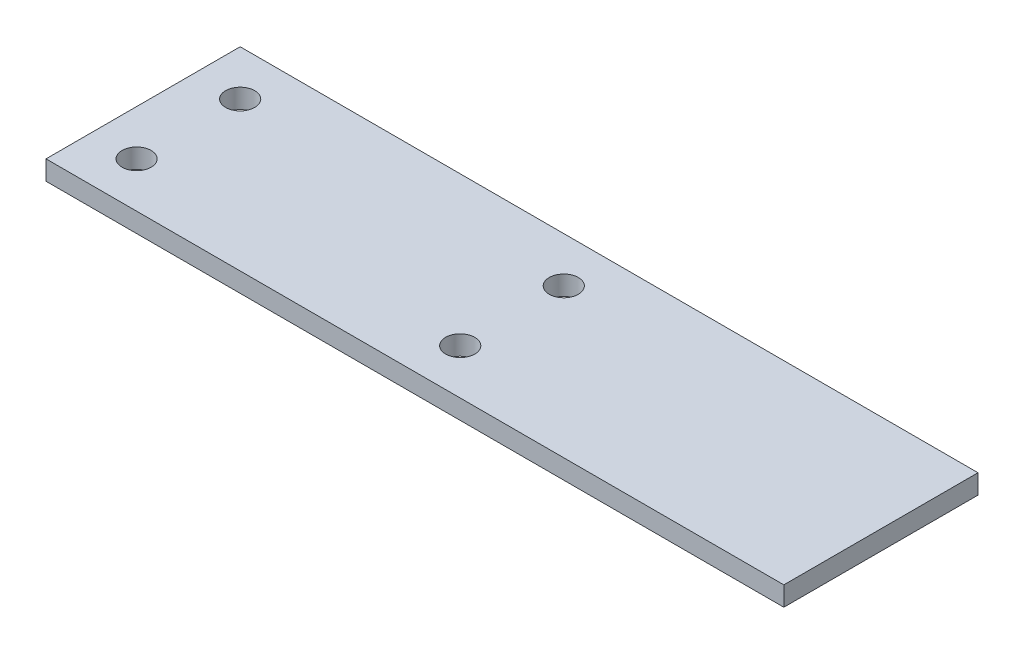
ISO-10303-21;
HEADER;
FILE_DESCRIPTION(('STEP AP214'),'2;1');
FILE_NAME('part.step','',(''),(''),'','','');
FILE_SCHEMA(('AUTOMOTIVE_DESIGN { 1 0 10303 214 1 1 1 1 }'));
ENDSEC;
DATA;
#1=APPLICATION_CONTEXT('core data for automotive mechanical design processes');
#2=APPLICATION_PROTOCOL_DEFINITION('international standard','automotive_design',2000,#1);
#3=PRODUCT_CONTEXT('',#1,'mechanical');
#4=PRODUCT('Part','Part','',(#3));
#5=PRODUCT_RELATED_PRODUCT_CATEGORY('part','',(#4));
#6=PRODUCT_DEFINITION_FORMATION('','',#4);
#7=PRODUCT_DEFINITION_CONTEXT('part definition',#1,'design');
#8=PRODUCT_DEFINITION('design','',#6,#7);
#9=PRODUCT_DEFINITION_SHAPE('','',#8);
#10=(LENGTH_UNIT() NAMED_UNIT(*) SI_UNIT(.MILLI.,.METRE.));
#11=(NAMED_UNIT(*) PLANE_ANGLE_UNIT() SI_UNIT($,.RADIAN.));
#12=(NAMED_UNIT(*) SI_UNIT($,.STERADIAN.) SOLID_ANGLE_UNIT());
#13=UNCERTAINTY_MEASURE_WITH_UNIT(LENGTH_MEASURE(1.E-05),#10,'distance_accuracy_value','');
#14=(GEOMETRIC_REPRESENTATION_CONTEXT(3) GLOBAL_UNCERTAINTY_ASSIGNED_CONTEXT((#13)) GLOBAL_UNIT_ASSIGNED_CONTEXT((#10,
#11,#12)) REPRESENTATION_CONTEXT('',''));
#15=CARTESIAN_POINT('',(0.,0.,0.));
#16=DIRECTION('',(0.,0.,1.));
#17=DIRECTION('',(1.,0.,0.));
#18=AXIS2_PLACEMENT_3D('',#15,#16,#17);
#19=CARTESIAN_POINT('',(0.,3.,0.));
#20=DIRECTION('',(0.,-1.,0.));
#21=DIRECTION('',(0.,0.,-1.));
#22=AXIS2_PLACEMENT_3D('',#19,#20,#21);
#23=PLANE('',#22);
#24=DIRECTION('',(-1.,0.,0.));
#25=VECTOR('',#24,1.);
#26=CARTESIAN_POINT('',(-7.,3.,-23.));
#27=LINE('',#26,#25);
#28=CARTESIAN_POINT('',(107.,3.,-23.));
#29=VERTEX_POINT('',#28);
#30=CARTESIAN_POINT('',(-7.,3.,-23.));
#31=VERTEX_POINT('',#30);
#32=EDGE_CURVE('E50',#29,#31,#27,.T.);
#33=ORIENTED_EDGE('',*,*,#32,.T.);
#34=DIRECTION('',(0.,0.,1.));
#35=VECTOR('',#34,1.);
#36=CARTESIAN_POINT('',(-7.,3.,-23.));
#37=LINE('',#36,#35);
#38=CARTESIAN_POINT('',(-7.,3.,7.));
#39=VERTEX_POINT('',#38);
#40=EDGE_CURVE('E80',#31,#39,#37,.T.);
#41=ORIENTED_EDGE('',*,*,#40,.T.);
#42=DIRECTION('',(1.,0.,0.));
#43=VECTOR('',#42,1.);
#44=CARTESIAN_POINT('',(57.,3.,7.));
#45=LINE('',#44,#43);
#46=CARTESIAN_POINT('',(107.,3.,7.));
#47=VERTEX_POINT('',#46);
#48=EDGE_CURVE('E84',#39,#47,#45,.T.);
#49=ORIENTED_EDGE('',*,*,#48,.T.);
#50=DIRECTION('',(0.,0.,-1.));
#51=VECTOR('',#50,1.);
#52=CARTESIAN_POINT('',(107.,3.,-23.));
#53=LINE('',#52,#51);
#54=EDGE_CURVE('E92',#47,#29,#53,.T.);
#55=ORIENTED_EDGE('',*,*,#54,.T.);
#56=EDGE_LOOP('',(#33,#41,#49,#55));
#57=FACE_BOUND('',#56,.T.);
#58=CARTESIAN_POINT('',(0.,3.,0.));
#59=DIRECTION('',(0.,1.,0.));
#60=DIRECTION('',(0.,0.,1.));
#61=AXIS2_PLACEMENT_3D('',#58,#59,#60);
#62=CIRCLE('',#61,2.25);
#63=CARTESIAN_POINT('',(0.,3.,2.25));
#64=VERTEX_POINT('',#63);
#65=EDGE_CURVE('E99',#64,#64,#62,.T.);
#66=ORIENTED_EDGE('',*,*,#65,.F.);
#67=EDGE_LOOP('',(#66));
#68=FACE_BOUND('',#67,.T.);
#69=CARTESIAN_POINT('',(0.,3.,-16.));
#70=DIRECTION('',(0.,1.,0.));
#71=DIRECTION('',(0.,0.,1.));
#72=AXIS2_PLACEMENT_3D('',#69,#70,#71);
#73=CIRCLE('',#72,2.25);
#74=CARTESIAN_POINT('',(0.,3.,-13.75));
#75=VERTEX_POINT('',#74);
#76=EDGE_CURVE('E160',#75,#75,#73,.T.);
#77=ORIENTED_EDGE('',*,*,#76,.F.);
#78=EDGE_LOOP('',(#77));
#79=FACE_BOUND('',#78,.T.);
#80=CARTESIAN_POINT('',(50.,3.,0.));
#81=DIRECTION('',(0.,1.,0.));
#82=DIRECTION('',(0.,0.,1.));
#83=AXIS2_PLACEMENT_3D('',#80,#81,#82);
#84=CIRCLE('',#83,2.25);
#85=CARTESIAN_POINT('',(50.,3.,2.25));
#86=VERTEX_POINT('',#85);
#87=EDGE_CURVE('E154',#86,#86,#84,.T.);
#88=ORIENTED_EDGE('',*,*,#87,.F.);
#89=EDGE_LOOP('',(#88));
#90=FACE_BOUND('',#89,.T.);
#91=CARTESIAN_POINT('',(50.,3.,-16.));
#92=DIRECTION('',(0.,1.,0.));
#93=DIRECTION('',(0.,0.,1.));
#94=AXIS2_PLACEMENT_3D('',#91,#92,#93);
#95=CIRCLE('',#94,2.25);
#96=CARTESIAN_POINT('',(50.,3.,-13.75));
#97=VERTEX_POINT('',#96);
#98=EDGE_CURVE('E145',#97,#97,#95,.T.);
#99=ORIENTED_EDGE('',*,*,#98,.F.);
#100=EDGE_LOOP('',(#99));
#101=FACE_BOUND('',#100,.T.);
#102=ADVANCED_FACE('F33',(#57,#68,#79,#90,#101),#23,.F.);
#103=CARTESIAN_POINT('',(0.,0.,0.));
#104=DIRECTION('',(0.,-1.,0.));
#105=DIRECTION('',(0.,0.,-1.));
#106=AXIS2_PLACEMENT_3D('',#103,#104,#105);
#107=PLANE('',#106);
#108=CARTESIAN_POINT('',(50.,0.,0.));
#109=DIRECTION('',(0.,1.,0.));
#110=DIRECTION('',(0.,0.,1.));
#111=AXIS2_PLACEMENT_3D('',#108,#109,#110);
#112=CIRCLE('',#111,2.25);
#113=CARTESIAN_POINT('',(50.,0.,2.25));
#114=VERTEX_POINT('',#113);
#115=EDGE_CURVE('E151',#114,#114,#112,.T.);
#116=ORIENTED_EDGE('',*,*,#115,.T.);
#117=EDGE_LOOP('',(#116));
#118=FACE_BOUND('',#117,.T.);
#119=CARTESIAN_POINT('',(0.,0.,0.));
#120=DIRECTION('',(0.,1.,0.));
#121=DIRECTION('',(0.,0.,1.));
#122=AXIS2_PLACEMENT_3D('',#119,#120,#121);
#123=CIRCLE('',#122,2.25);
#124=CARTESIAN_POINT('',(0.,0.,2.25));
#125=VERTEX_POINT('',#124);
#126=EDGE_CURVE('E163',#125,#125,#123,.T.);
#127=ORIENTED_EDGE('',*,*,#126,.T.);
#128=EDGE_LOOP('',(#127));
#129=FACE_BOUND('',#128,.T.);
#130=DIRECTION('',(0.,0.,1.));
#131=VECTOR('',#130,1.);
#132=CARTESIAN_POINT('',(-7.,0.,-23.));
#133=LINE('',#132,#131);
#134=CARTESIAN_POINT('',(-7.,0.,-23.));
#135=VERTEX_POINT('',#134);
#136=CARTESIAN_POINT('',(-7.,0.,7.));
#137=VERTEX_POINT('',#136);
#138=EDGE_CURVE('E88',#135,#137,#133,.T.);
#139=ORIENTED_EDGE('',*,*,#138,.F.);
#140=DIRECTION('',(-1.,0.,0.));
#141=VECTOR('',#140,1.);
#142=CARTESIAN_POINT('',(57.,0.,-23.));
#143=LINE('',#142,#141);
#144=CARTESIAN_POINT('',(107.,0.,-23.));
#145=VERTEX_POINT('',#144);
#146=EDGE_CURVE('E102',#145,#135,#143,.T.);
#147=ORIENTED_EDGE('',*,*,#146,.F.);
#148=DIRECTION('',(0.,0.,-1.));
#149=VECTOR('',#148,1.);
#150=CARTESIAN_POINT('',(107.,0.,-23.));
#151=LINE('',#150,#149);
#152=CARTESIAN_POINT('',(107.,0.,7.));
#153=VERTEX_POINT('',#152);
#154=EDGE_CURVE('E74',#153,#145,#151,.T.);
#155=ORIENTED_EDGE('',*,*,#154,.F.);
#156=DIRECTION('',(1.,0.,0.));
#157=VECTOR('',#156,1.);
#158=CARTESIAN_POINT('',(107.,0.,7.));
#159=LINE('',#158,#157);
#160=EDGE_CURVE('E67',#137,#153,#159,.T.);
#161=ORIENTED_EDGE('',*,*,#160,.F.);
#162=EDGE_LOOP('',(#139,#147,#155,#161));
#163=FACE_BOUND('',#162,.T.);
#164=CARTESIAN_POINT('',(0.,0.,-16.));
#165=DIRECTION('',(0.,1.,0.));
#166=DIRECTION('',(0.,0.,1.));
#167=AXIS2_PLACEMENT_3D('',#164,#165,#166);
#168=CIRCLE('',#167,2.25);
#169=CARTESIAN_POINT('',(0.,0.,-13.75));
#170=VERTEX_POINT('',#169);
#171=EDGE_CURVE('E157',#170,#170,#168,.T.);
#172=ORIENTED_EDGE('',*,*,#171,.T.);
#173=EDGE_LOOP('',(#172));
#174=FACE_BOUND('',#173,.T.);
#175=CARTESIAN_POINT('',(50.,0.,-16.));
#176=DIRECTION('',(0.,1.,0.));
#177=DIRECTION('',(0.,0.,1.));
#178=AXIS2_PLACEMENT_3D('',#175,#176,#177);
#179=CIRCLE('',#178,2.25);
#180=CARTESIAN_POINT('',(50.,0.,-13.75));
#181=VERTEX_POINT('',#180);
#182=EDGE_CURVE('E148',#181,#181,#179,.T.);
#183=ORIENTED_EDGE('',*,*,#182,.T.);
#184=EDGE_LOOP('',(#183));
#185=FACE_BOUND('',#184,.T.);
#186=ADVANCED_FACE('F108',(#118,#129,#163,#174,#185),#107,.T.);
#187=CARTESIAN_POINT('',(-7.,3.,-23.));
#188=DIRECTION('',(1.,0.,0.));
#189=DIRECTION('',(0.,0.,-1.));
#190=AXIS2_PLACEMENT_3D('',#187,#188,#189);
#191=PLANE('',#190);
#192=ORIENTED_EDGE('',*,*,#138,.T.);
#193=DIRECTION('',(0.,-1.,0.));
#194=VECTOR('',#193,1.);
#195=CARTESIAN_POINT('',(-7.,3.,7.));
#196=LINE('',#195,#194);
#197=EDGE_CURVE('E42',#39,#137,#196,.T.);
#198=ORIENTED_EDGE('',*,*,#197,.F.);
#199=ORIENTED_EDGE('',*,*,#40,.F.);
#200=DIRECTION('',(0.,-1.,0.));
#201=VECTOR('',#200,1.);
#202=CARTESIAN_POINT('',(-7.,3.,-23.));
#203=LINE('',#202,#201);
#204=EDGE_CURVE('E11',#31,#135,#203,.T.);
#205=ORIENTED_EDGE('',*,*,#204,.T.);
#206=EDGE_LOOP('',(#192,#198,#199,#205));
#207=FACE_BOUND('',#206,.T.);
#208=ADVANCED_FACE('F35',(#207),#191,.F.);
#209=CARTESIAN_POINT('',(107.,3.,7.));
#210=DIRECTION('',(0.,0.,-1.));
#211=DIRECTION('',(-1.,0.,0.));
#212=AXIS2_PLACEMENT_3D('',#209,#210,#211);
#213=PLANE('',#212);
#214=ORIENTED_EDGE('',*,*,#160,.T.);
#215=DIRECTION('',(0.,-1.,0.));
#216=VECTOR('',#215,1.);
#217=CARTESIAN_POINT('',(107.,3.,7.));
#218=LINE('',#217,#216);
#219=EDGE_CURVE('E89',#47,#153,#218,.T.);
#220=ORIENTED_EDGE('',*,*,#219,.F.);
#221=ORIENTED_EDGE('',*,*,#48,.F.);
#222=ORIENTED_EDGE('',*,*,#197,.T.);
#223=EDGE_LOOP('',(#214,#220,#221,#222));
#224=FACE_BOUND('',#223,.T.);
#225=ADVANCED_FACE('F90',(#224),#213,.F.);
#226=CARTESIAN_POINT('',(107.,3.,-23.));
#227=DIRECTION('',(-1.,0.,0.));
#228=DIRECTION('',(0.,0.,1.));
#229=AXIS2_PLACEMENT_3D('',#226,#227,#228);
#230=PLANE('',#229);
#231=ORIENTED_EDGE('',*,*,#154,.T.);
#232=DIRECTION('',(0.,-1.,0.));
#233=VECTOR('',#232,1.);
#234=CARTESIAN_POINT('',(107.,3.,-23.));
#235=LINE('',#234,#233);
#236=EDGE_CURVE('E94',#29,#145,#235,.T.);
#237=ORIENTED_EDGE('',*,*,#236,.F.);
#238=ORIENTED_EDGE('',*,*,#54,.F.);
#239=ORIENTED_EDGE('',*,*,#219,.T.);
#240=EDGE_LOOP('',(#231,#237,#238,#239));
#241=FACE_BOUND('',#240,.T.);
#242=ADVANCED_FACE('F105',(#241),#230,.F.);
#243=CARTESIAN_POINT('',(57.,3.,-23.));
#244=DIRECTION('',(0.,0.,1.));
#245=DIRECTION('',(1.,0.,0.));
#246=AXIS2_PLACEMENT_3D('',#243,#244,#245);
#247=PLANE('',#246);
#248=ORIENTED_EDGE('',*,*,#146,.T.);
#249=ORIENTED_EDGE('',*,*,#204,.F.);
#250=ORIENTED_EDGE('',*,*,#32,.F.);
#251=ORIENTED_EDGE('',*,*,#236,.T.);
#252=EDGE_LOOP('',(#248,#249,#250,#251));
#253=FACE_BOUND('',#252,.T.);
#254=ADVANCED_FACE('F110',(#253),#247,.F.);
#255=CARTESIAN_POINT('',(0.,3.,0.));
#256=DIRECTION('',(0.,-1.,0.));
#257=DIRECTION('',(0.,0.,-1.));
#258=AXIS2_PLACEMENT_3D('',#255,#256,#257);
#259=CYLINDRICAL_SURFACE('',#258,2.25);
#260=ORIENTED_EDGE('',*,*,#65,.T.);
#261=EDGE_LOOP('',(#260));
#262=FACE_BOUND('',#261,.T.);
#263=ORIENTED_EDGE('',*,*,#126,.F.);
#264=EDGE_LOOP('',(#263));
#265=FACE_BOUND('',#264,.T.);
#266=ADVANCED_FACE('F112',(#262,#265),#259,.F.);
#267=CARTESIAN_POINT('',(0.,3.,-16.));
#268=DIRECTION('',(0.,-1.,0.));
#269=DIRECTION('',(0.,0.,-1.));
#270=AXIS2_PLACEMENT_3D('',#267,#268,#269);
#271=CYLINDRICAL_SURFACE('',#270,2.25);
#272=ORIENTED_EDGE('',*,*,#76,.T.);
#273=EDGE_LOOP('',(#272));
#274=FACE_BOUND('',#273,.T.);
#275=ORIENTED_EDGE('',*,*,#171,.F.);
#276=EDGE_LOOP('',(#275));
#277=FACE_BOUND('',#276,.T.);
#278=ADVANCED_FACE('F118',(#274,#277),#271,.F.);
#279=CARTESIAN_POINT('',(50.,3.,0.));
#280=DIRECTION('',(0.,-1.,0.));
#281=DIRECTION('',(0.,0.,-1.));
#282=AXIS2_PLACEMENT_3D('',#279,#280,#281);
#283=CYLINDRICAL_SURFACE('',#282,2.25);
#284=ORIENTED_EDGE('',*,*,#87,.T.);
#285=EDGE_LOOP('',(#284));
#286=FACE_BOUND('',#285,.T.);
#287=ORIENTED_EDGE('',*,*,#115,.F.);
#288=EDGE_LOOP('',(#287));
#289=FACE_BOUND('',#288,.T.);
#290=ADVANCED_FACE('F132',(#286,#289),#283,.F.);
#291=CARTESIAN_POINT('',(50.,3.,-16.));
#292=DIRECTION('',(0.,-1.,0.));
#293=DIRECTION('',(0.,0.,-1.));
#294=AXIS2_PLACEMENT_3D('',#291,#292,#293);
#295=CYLINDRICAL_SURFACE('',#294,2.25);
#296=ORIENTED_EDGE('',*,*,#98,.T.);
#297=EDGE_LOOP('',(#296));
#298=FACE_BOUND('',#297,.T.);
#299=ORIENTED_EDGE('',*,*,#182,.F.);
#300=EDGE_LOOP('',(#299));
#301=FACE_BOUND('',#300,.T.);
#302=ADVANCED_FACE('F136',(#298,#301),#295,.F.);
#303=CLOSED_SHELL('',(#102,#186,#208,#225,#242,#254,#266,#278,#290,#302));
#304=MANIFOLD_SOLID_BREP('B2',#303);
#305=ADVANCED_BREP_SHAPE_REPRESENTATION('',(#18,#304),#14);
#306=SHAPE_DEFINITION_REPRESENTATION(#9,#305);
ENDSEC;
END-ISO-10303-21;
